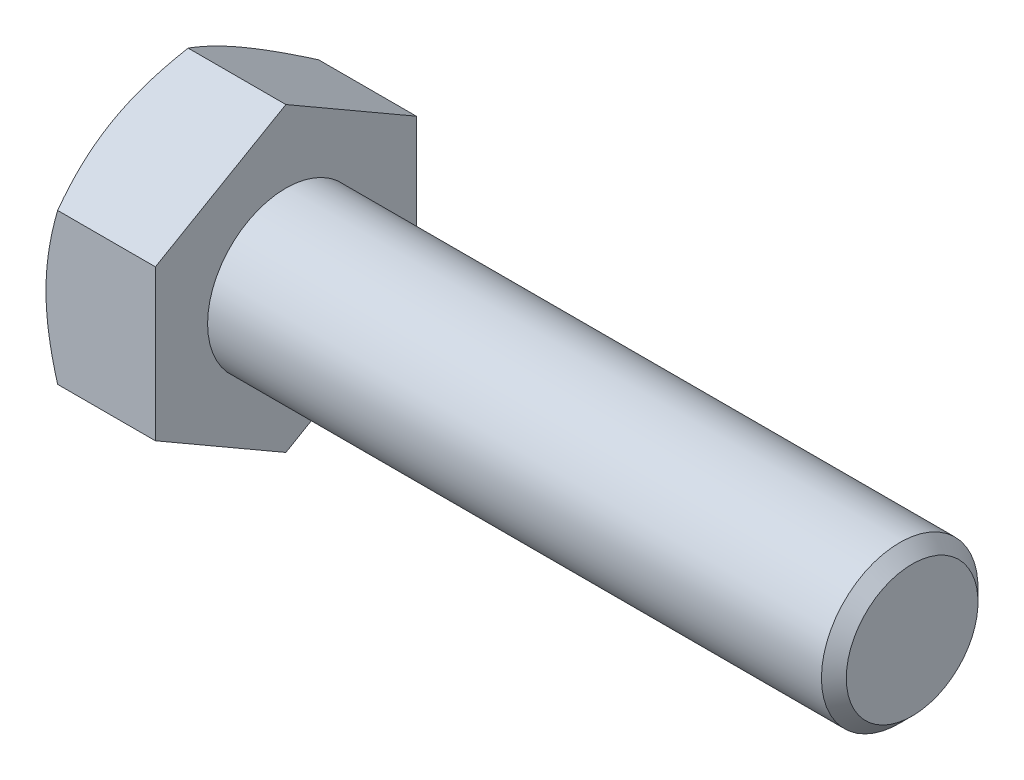
ISO-10303-21;
HEADER;
FILE_DESCRIPTION(('STEP AP214'),'2;1');
FILE_NAME('part.step','',(''),(''),'','','');
FILE_SCHEMA(('AUTOMOTIVE_DESIGN { 1 0 10303 214 1 1 1 1 }'));
ENDSEC;
DATA;
#1=APPLICATION_CONTEXT('core data for automotive mechanical design processes');
#2=APPLICATION_PROTOCOL_DEFINITION('international standard','automotive_design',2000,#1);
#3=PRODUCT_CONTEXT('',#1,'mechanical');
#4=PRODUCT('Part','Part','',(#3));
#5=PRODUCT_RELATED_PRODUCT_CATEGORY('part','',(#4));
#6=PRODUCT_DEFINITION_FORMATION('','',#4);
#7=PRODUCT_DEFINITION_CONTEXT('part definition',#1,'design');
#8=PRODUCT_DEFINITION('design','',#6,#7);
#9=PRODUCT_DEFINITION_SHAPE('','',#8);
#10=(LENGTH_UNIT() NAMED_UNIT(*) SI_UNIT(.MILLI.,.METRE.));
#11=(NAMED_UNIT(*) PLANE_ANGLE_UNIT() SI_UNIT($,.RADIAN.));
#12=(NAMED_UNIT(*) SI_UNIT($,.STERADIAN.) SOLID_ANGLE_UNIT());
#13=UNCERTAINTY_MEASURE_WITH_UNIT(LENGTH_MEASURE(1.E-05),#10,'distance_accuracy_value','');
#14=(GEOMETRIC_REPRESENTATION_CONTEXT(3) GLOBAL_UNCERTAINTY_ASSIGNED_CONTEXT((#13)) GLOBAL_UNIT_ASSIGNED_CONTEXT((#10,
#11,#12)) REPRESENTATION_CONTEXT('',''));
#15=CARTESIAN_POINT('',(0.,0.,0.));
#16=DIRECTION('',(0.,0.,1.));
#17=DIRECTION('',(1.,0.,0.));
#18=AXIS2_PLACEMENT_3D('',#15,#16,#17);
#19=CARTESIAN_POINT('',(13.3096,9.1654355233853,-15.875));
#20=DIRECTION('',(0.,-0.866025403784438,0.500000000000001));
#21=DIRECTION('',(0.,-0.500000000000001,-0.866025403784438));
#22=AXIS2_PLACEMENT_3D('',#19,#20,#21);
#23=PLANE('',#22);
#24=CARTESIAN_POINT('',(1.4179644772446,18.3309865168245,0.000200000000000058));
#25=CARTESIAN_POINT('',(1.30166349935356,18.1295339032351,-0.348726162054331));
#26=CARTESIAN_POINT('',(1.19064005208184,17.9272955162446,-0.699013323562702));
#27=CARTESIAN_POINT('',(0.980615189404248,17.5211970290311,-1.40239653629325));
#28=CARTESIAN_POINT('',(0.881617728014486,17.317336418786,-1.75549347089973));
#29=CARTESIAN_POINT('',(0.696975569734934,16.907599504169,-2.46517862475286));
#30=CARTESIAN_POINT('',(0.611362465613034,16.7017196143403,-2.8217730541929));
#31=CARTESIAN_POINT('',(0.45532738618748,16.2885292208317,-3.53743980894913));
#32=CARTESIAN_POINT('',(0.384904544248683,16.0812187994634,-3.89651199169763));
#33=CARTESIAN_POINT('',(0.262245312069867,15.6704794179803,-4.60793346909577));
#34=CARTESIAN_POINT('',(0.209602940833891,15.4670809513971,-4.96022994739949));
#35=CARTESIAN_POINT('',(0.121333390113917,15.0593520108342,-5.66643718817071));
#36=CARTESIAN_POINT('',(0.0857065381436126,14.8550215189913,-6.02034798157808));
#37=CARTESIAN_POINT('',(0.0323675832627824,14.4460172919899,-6.72876408325501));
#38=CARTESIAN_POINT('',(0.0146341921733754,14.2413442555777,-7.08326818126032));
#39=CARTESIAN_POINT('',(-0.00253647190704181,13.8318092543273,-7.79260361090378));
#40=CARTESIAN_POINT('',(-0.00197431023682724,13.6269472955224,-8.14743493209182));
#41=CARTESIAN_POINT('',(0.0161681092927598,13.2439598321846,-8.81078867725483));
#42=CARTESIAN_POINT('',(0.031535428502355,13.0658070333877,-9.11935837628174));
#43=CARTESIAN_POINT('',(0.0758164731953725,12.7099112295066,-9.73578799080438));
#44=CARTESIAN_POINT('',(0.104731156842696,12.5321682543017,-10.0436478545477));
#45=CARTESIAN_POINT('',(0.175602789161407,12.177188641073,-10.6584905803109));
#46=CARTESIAN_POINT('',(0.217570509466567,11.9999525436897,-10.9654725059141));
#47=CARTESIAN_POINT('',(0.313811907196353,11.6463112615745,-11.5779971741913));
#48=CARTESIAN_POINT('',(0.368086421198047,11.469906134162,-11.8835398175855));
#49=CARTESIAN_POINT('',(0.550742134607826,10.9344186122588,-12.811031412341));
#50=CARTESIAN_POINT('',(0.697335929410169,10.57688689335,-13.4302945148085));
#51=CARTESIAN_POINT('',(1.03004377733919,9.86715465547037,-14.6595868105855));
#52=CARTESIAN_POINT('',(1.21607969409906,9.51494504971995,-15.2696317426591));
#53=CARTESIAN_POINT('',(1.4179644772446,9.16532005333146,-15.8752));
#54=B_SPLINE_CURVE_WITH_KNOTS('',3,(#24,#25,#26,#27,#28,#29,#30,#31,#32,#33,#34,#35,#36,#37,#38,
#39,#40,#41,#42,#43,#44,#45,#46,#47,#48,#49,#50,#51,#52,#53),.UNSPECIFIED.,.F.,.F.,(4,2,2,2,2,2,
2,2,2,2,2,2,2,2,4),(0.,1.25809764419015,2.5166078242971,3.77804517463509,5.03941053837783,
6.26964248180284,7.49989810370428,8.72868833599616,9.95744059828984,11.0270932391011,
12.0968215446148,13.1674349646019,14.238121183346,16.4265775361706,18.6107383192463),.UNSPECIFIED.);
#55=CARTESIAN_POINT('',(1.41789780994802,18.3308710467706,0.));
#56=VERTEX_POINT('',#55);
#57=CARTESIAN_POINT('',(0.,13.748153285078,-7.93750000000001));
#58=VERTEX_POINT('',#57);
#59=EDGE_CURVE('E49',#56,#58,#54,.T.);
#60=ORIENTED_EDGE('',*,*,#59,.F.);
#61=DIRECTION('',(-1.,0.,0.));
#62=VECTOR('',#61,1.);
#63=CARTESIAN_POINT('',(13.3096,18.3308710467706,0.));
#64=LINE('',#63,#62);
#65=CARTESIAN_POINT('',(13.3096,18.3308710467706,0.));
#66=VERTEX_POINT('',#65);
#67=EDGE_CURVE('E145',#66,#56,#64,.T.);
#68=ORIENTED_EDGE('',*,*,#67,.F.);
#69=DIRECTION('',(0.,0.500000000000001,0.866025403784438));
#70=VECTOR('',#69,1.);
#71=CARTESIAN_POINT('',(13.3096,9.1654355233853,-15.875));
#72=LINE('',#71,#70);
#73=CARTESIAN_POINT('',(13.3096,9.1654355233853,-15.875));
#74=VERTEX_POINT('',#73);
#75=EDGE_CURVE('E236',#74,#66,#72,.T.);
#76=ORIENTED_EDGE('',*,*,#75,.F.);
#77=DIRECTION('',(-1.,0.,0.));
#78=VECTOR('',#77,1.);
#79=CARTESIAN_POINT('',(13.3096,9.1654355233853,-15.875));
#80=LINE('',#79,#78);
#81=CARTESIAN_POINT('',(1.41789780994801,9.1654355233853,-15.875));
#82=VERTEX_POINT('',#81);
#83=EDGE_CURVE('E133',#74,#82,#80,.T.);
#84=ORIENTED_EDGE('',*,*,#83,.T.);
#85=EDGE_CURVE('E127',#58,#82,#54,.T.);
#86=ORIENTED_EDGE('',*,*,#85,.F.);
#87=EDGE_LOOP('',(#60,#68,#76,#84,#86));
#88=FACE_BOUND('',#87,.T.);
#89=ADVANCED_FACE('F33',(#88),#23,.F.);
#90=CARTESIAN_POINT('',(13.3096,18.3308710467706,0.));
#91=DIRECTION('',(0.,-0.866025403784438,-0.500000000000001));
#92=DIRECTION('',(0.,0.500000000000001,-0.866025403784438));
#93=AXIS2_PLACEMENT_3D('',#90,#91,#92);
#94=PLANE('',#93);
#95=CARTESIAN_POINT('',(1.4179644772446,9.16532005333146,15.8752));
#96=CARTESIAN_POINT('',(1.30166349935355,9.36677266692083,15.5262738379457));
#97=CARTESIAN_POINT('',(1.19064005208183,9.56901105391136,15.1759866764373));
#98=CARTESIAN_POINT('',(0.98061518940424,9.97510954112481,14.4726034637067));
#99=CARTESIAN_POINT('',(0.881617728014476,10.1789701513699,14.1195065291003));
#100=CARTESIAN_POINT('',(0.696975569734926,10.5887070659869,13.4098213752471));
#101=CARTESIAN_POINT('',(0.611362465613028,10.7945869558156,13.0532269458071));
#102=CARTESIAN_POINT('',(0.455327386187475,11.2077773493242,12.3375601910509));
#103=CARTESIAN_POINT('',(0.384904544248679,11.4150877706925,11.9784880083024));
#104=CARTESIAN_POINT('',(0.262245312069862,11.8258271521756,11.2670665309042));
#105=CARTESIAN_POINT('',(0.209602940833887,12.0292256187588,10.9147700526005));
#106=CARTESIAN_POINT('',(0.121333390113914,12.4369545593218,10.2085628118293));
#107=CARTESIAN_POINT('',(0.0857065381436114,12.6412850511646,9.85465201842192));
#108=CARTESIAN_POINT('',(0.0323675832627816,13.0502892781661,9.14623591674499));
#109=CARTESIAN_POINT('',(0.0146341921733736,13.2549623145783,8.79173181873968));
#110=CARTESIAN_POINT('',(-0.00253647190704405,13.6644973158287,8.08239638909623));
#111=CARTESIAN_POINT('',(-0.00197431023682896,13.8693592746335,7.72756506790819));
#112=CARTESIAN_POINT('',(0.0161681092927607,14.2523467379713,7.06421132274518));
#113=CARTESIAN_POINT('',(0.0315354285023579,14.4304995367682,6.75564162371827));
#114=CARTESIAN_POINT('',(0.0758164731953773,14.7863953406493,6.13921200919563));
#115=CARTESIAN_POINT('',(0.104731156842701,14.9641383158542,5.83135214545234));
#116=CARTESIAN_POINT('',(0.175602789161412,15.3191179290829,5.21650941968907));
#117=CARTESIAN_POINT('',(0.217570509466573,15.4963540264663,4.90952749408591));
#118=CARTESIAN_POINT('',(0.313811907196359,15.8499953085814,4.29700282580869));
#119=CARTESIAN_POINT('',(0.368086421198053,16.026400435994,3.99146018241446));
#120=CARTESIAN_POINT('',(0.550742134607834,16.5618879578971,3.06396858765902));
#121=CARTESIAN_POINT('',(0.697335929410176,16.919419676806,2.44470548519147));
#122=CARTESIAN_POINT('',(1.0300437773392,17.6291519146856,1.21541318941447));
#123=CARTESIAN_POINT('',(1.21607969409907,17.981361520436,0.605368257340947));
#124=CARTESIAN_POINT('',(1.41796447724461,18.3309865168245,-0.000200000000000437));
#125=B_SPLINE_CURVE_WITH_KNOTS('',3,(#95,#96,#97,#98,#99,#100,#101,#102,#103,#104,#105,#106,
#107,#108,#109,#110,#111,#112,#113,#114,#115,#116,#117,#118,#119,#120,#121,#122,#123,#124),
.UNSPECIFIED.,.F.,.F.,(4,2,2,2,2,2,2,2,2,2,2,2,2,2,4),(0.,1.25809764419015,2.5166078242971,
3.77804517463509,5.03941053837783,6.26964248180283,7.49989810370428,8.72868833599616,
9.95744059828984,11.0270932391011,12.0968215446148,13.1674349646019,14.238121183346,
16.4265775361706,18.6107383192463),.UNSPECIFIED.);
#126=CARTESIAN_POINT('',(1.41789780994801,9.1654355233853,15.875));
#127=VERTEX_POINT('',#126);
#128=CARTESIAN_POINT('',(0.,13.748153285078,7.93750000000002));
#129=VERTEX_POINT('',#128);
#130=EDGE_CURVE('E56',#127,#129,#125,.T.);
#131=ORIENTED_EDGE('',*,*,#130,.F.);
#132=DIRECTION('',(-1.,0.,0.));
#133=VECTOR('',#132,1.);
#134=CARTESIAN_POINT('',(13.3096,9.1654355233853,15.875));
#135=LINE('',#134,#133);
#136=CARTESIAN_POINT('',(13.3096,9.1654355233853,15.875));
#137=VERTEX_POINT('',#136);
#138=EDGE_CURVE('E143',#137,#127,#135,.T.);
#139=ORIENTED_EDGE('',*,*,#138,.F.);
#140=DIRECTION('',(0.,-0.500000000000001,0.866025403784438));
#141=VECTOR('',#140,1.);
#142=CARTESIAN_POINT('',(13.3096,18.3308710467706,0.));
#143=LINE('',#142,#141);
#144=EDGE_CURVE('E234',#66,#137,#143,.T.);
#145=ORIENTED_EDGE('',*,*,#144,.F.);
#146=ORIENTED_EDGE('',*,*,#67,.T.);
#147=EDGE_CURVE('E160',#129,#56,#125,.T.);
#148=ORIENTED_EDGE('',*,*,#147,.F.);
#149=EDGE_LOOP('',(#131,#139,#145,#146,#148));
#150=FACE_BOUND('',#149,.T.);
#151=ADVANCED_FACE('F166',(#150),#94,.F.);
#152=CARTESIAN_POINT('',(13.3096,9.1654355233853,15.875));
#153=DIRECTION('',(0.,0.,-1.));
#154=DIRECTION('',(-1.,0.,0.));
#155=AXIS2_PLACEMENT_3D('',#152,#153,#154);
#156=PLANE('',#155);
#157=CARTESIAN_POINT('',(7.8449738665648,-24.8202831942167,15.875));
#158=CARTESIAN_POINT('',(7.67595391610504,-24.4727664687582,15.875));
#159=CARTESIAN_POINT('',(7.50776171164911,-24.1248473453157,15.875));
#160=CARTESIAN_POINT('',(7.17321986885552,-23.4281204028295,15.875));
#161=CARTESIAN_POINT('',(7.00687024843962,-23.0793125751824,15.875));
#162=CARTESIAN_POINT('',(6.51082331866861,-22.031340044132,15.875));
#163=CARTESIAN_POINT('',(6.18417657561707,-21.3307260199499,15.875));
#164=CARTESIAN_POINT('',(5.53923926992154,-19.9211586358427,15.875));
#165=CARTESIAN_POINT('',(5.22100216769578,-19.2121807579059,15.875));
#166=CARTESIAN_POINT('',(4.59728002286789,-17.7886568536021,15.875));
#167=CARTESIAN_POINT('',(4.29179439112062,-17.0741110862975,15.875));
#168=CARTESIAN_POINT('',(3.68705721665467,-15.6144543218925,15.875));
#169=CARTESIAN_POINT('',(3.38835008065788,-14.869116616556,15.875));
#170=CARTESIAN_POINT('',(2.81305944514715,-13.3697904144502,15.875));
#171=CARTESIAN_POINT('',(2.53647840049528,-12.6158009683632,15.875));
#172=CARTESIAN_POINT('',(2.01255860722672,-11.0993435359999,15.875));
#173=CARTESIAN_POINT('',(1.76516234753209,-10.3368955770385,15.875));
#174=CARTESIAN_POINT('',(1.30740290737887,-8.80099241673028,15.875));
#175=CARTESIAN_POINT('',(1.09702827238097,-8.02754070029573,15.875));
#176=CARTESIAN_POINT('',(0.817325617572153,-6.86111841594317,15.875));
#177=CARTESIAN_POINT('',(0.73026359893264,-6.47237592065168,15.875));
#178=CARTESIAN_POINT('',(0.56910867905308,-5.69219801218947,15.875));
#179=CARTESIAN_POINT('',(0.49501552140516,-5.30076265241853,15.875));
#180=CARTESIAN_POINT('',(0.361093380789722,-4.5154534684337,15.875));
#181=CARTESIAN_POINT('',(0.301264170074855,-4.1215796832563,15.875));
#182=CARTESIAN_POINT('',(0.197055971874635,-3.33179689837237,15.875));
#183=CARTESIAN_POINT('',(0.152676301807647,-2.93588798936482,15.875));
#184=CARTESIAN_POINT('',(0.0808161975917861,-2.14784188257325,15.875));
#185=CARTESIAN_POINT('',(0.0531187557699647,-1.75572459558229,15.875));
#186=CARTESIAN_POINT('',(0.0143409935999058,-0.970670139802986,15.875));
#187=CARTESIAN_POINT('',(0.00326039188680345,-0.577732985009881,15.875));
#188=CARTESIAN_POINT('',(-0.00201925130471729,0.208258020823028,15.875));
#189=CARTESIAN_POINT('',(0.00378172153558958,0.601311871961529,15.875));
#190=CARTESIAN_POINT('',(0.0321213076171285,1.38682038609096,15.875));
#191=CARTESIAN_POINT('',(0.0546606673300768,1.77927502157685,15.875));
#192=CARTESIAN_POINT('',(0.127986774695392,2.71645285640235,15.875));
#193=CARTESIAN_POINT('',(0.186380792561224,3.26059173949289,15.875));
#194=CARTESIAN_POINT('',(0.33221325139397,4.34496561712487,15.875));
#195=CARTESIAN_POINT('',(0.419655475266207,4.88520009383364,15.875));
#196=CARTESIAN_POINT('',(0.620474052556269,5.9612043869461,15.875));
#197=CARTESIAN_POINT('',(0.733870017611176,6.49697050795818,15.875));
#198=CARTESIAN_POINT('',(0.983124574893512,7.56319485623629,15.875));
#199=CARTESIAN_POINT('',(1.11898287475857,8.09365315249193,15.875));
#200=CARTESIAN_POINT('',(1.41309058085111,9.16105549068253,15.875));
#201=CARTESIAN_POINT('',(1.57177257001988,9.69787950685414,15.875));
#202=CARTESIAN_POINT('',(1.90593867975274,10.7662423985403,15.875));
#203=CARTESIAN_POINT('',(2.08142291423849,11.2977812381935,15.875));
#204=CARTESIAN_POINT('',(2.44637177911001,12.3558294430634,15.875));
#205=CARTESIAN_POINT('',(2.6358320415017,12.8823403220753,15.875));
#206=CARTESIAN_POINT('',(3.0264642312182,13.9309723057094,15.875));
#207=CARTESIAN_POINT('',(3.22763600157381,14.4530934690596,15.875));
#208=CARTESIAN_POINT('',(3.72655173579078,15.7125455250726,15.875));
#209=CARTESIAN_POINT('',(4.02928354883834,16.44789788487,15.875));
#210=CARTESIAN_POINT('',(4.65015898963173,17.9120878527412,15.875));
#211=CARTESIAN_POINT('',(4.96830369817316,18.6409249996929,15.875));
#212=CARTESIAN_POINT('',(5.61682913078198,20.0933407142771,15.875));
#213=CARTESIAN_POINT('',(5.94721292884127,20.8169179054689,15.875));
#214=CARTESIAN_POINT('',(6.617672219521,22.2595345089717,15.875));
#215=CARTESIAN_POINT('',(6.95774747453029,22.9785740320082,15.875));
#216=CARTESIAN_POINT('',(7.64613929747713,24.4137493738295,15.875));
#217=CARTESIAN_POINT('',(7.9944652449015,25.1298806854519,15.875));
#218=CARTESIAN_POINT('',(8.69752300673555,26.5589916209534,15.875));
#219=CARTESIAN_POINT('',(9.05225485281008,27.2719712292318,15.875));
#220=CARTESIAN_POINT('',(9.76694765394667,28.6951744466399,15.875));
#221=CARTESIAN_POINT('',(10.126907855315,29.4053984346646,15.875));
#222=CARTESIAN_POINT('',(10.8512282962132,30.82359492193,15.875));
#223=CARTESIAN_POINT('',(11.2155885265026,31.5315674258951,15.875));
#224=CARTESIAN_POINT('',(12.2500056643277,33.5287000442288,15.875));
#225=CARTESIAN_POINT('',(12.9243514359269,34.815638612065,15.875));
#226=CARTESIAN_POINT('',(14.2821577230813,37.384752577811,15.875));
#227=CARTESIAN_POINT('',(14.96561860221,38.6669277831013,15.875));
#228=CARTESIAN_POINT('',(16.3376382492631,41.224107123951,15.875));
#229=CARTESIAN_POINT('',(17.0261783698581,42.4991212713774,15.875));
#230=CARTESIAN_POINT('',(18.0630078608122,44.4094093383701,15.875));
#231=CARTESIAN_POINT('',(18.4092773558344,45.0457811933279,15.875));
#232=CARTESIAN_POINT('',(19.1030208958834,46.3178667849535,15.875));
#233=CARTESIAN_POINT('',(19.4504949390654,46.9535805226274,15.875));
#234=CARTESIAN_POINT('',(19.7985008753637,47.5890030378064,15.875));
#235=B_SPLINE_CURVE_WITH_KNOTS('',3,(#157,#158,#159,#160,#161,#162,#163,#164,#165,#166,#167,
#168,#169,#170,#171,#172,#173,#174,#175,#176,#177,#178,#179,#180,#181,#182,#183,#184,#185,#186,
#187,#188,#189,#190,#191,#192,#193,#194,#195,#196,#197,#198,#199,#200,#201,#202,#203,#204,#205,
#206,#207,#208,#209,#210,#211,#212,#213,#214,#215,#216,#217,#218,#219,#220,#221,#222,#223,#224,
#225,#226,#227,#228,#229,#230,#231,#232,#233,#234),.UNSPECIFIED.,.F.,.F.,(4,2,2,2,2,2,2,2,2,2,2,
2,2,2,2,2,2,2,2,2,2,2,2,2,2,2,2,2,2,2,2,2,2,2,2,2,2,2,4),(0.,1.15931697190947,2.31864520994502,
4.63763453110136,6.96891393744049,9.30008551420875,11.7087149522965,14.1176112552388,
16.5216783943489,18.9250003991386,20.1199361145776,21.3148482022251,22.5097412098598,
23.7045814188007,24.8835227916953,26.0624442019241,27.2413666120986,28.4203416011202,
30.061227688609,31.7023275501152,33.3446716075257,34.9869942904079,36.666023488277,
38.3450640710135,40.0235821005669,41.7020776381421,44.0875229720481,46.4731358228963,
48.859351965917,51.2455096549223,53.6345241845044,56.0235505264023,58.4122358303755,
60.8009161187089,65.1595962864933,69.5184508315968,73.8655858120792,76.0390257461071,
78.2124623526533),.UNSPECIFIED.);
#236=CARTESIAN_POINT('',(1.41789780994802,-9.16543552338532,15.875));
#237=VERTEX_POINT('',#236);
#238=CARTESIAN_POINT('',(0.,0.,15.875));
#239=VERTEX_POINT('',#238);
#240=EDGE_CURVE('E246',#237,#239,#235,.T.);
#241=ORIENTED_EDGE('',*,*,#240,.F.);
#242=DIRECTION('',(-1.,0.,0.));
#243=VECTOR('',#242,1.);
#244=CARTESIAN_POINT('',(13.3096,-9.16543552338532,15.875));
#245=LINE('',#244,#243);
#246=CARTESIAN_POINT('',(13.3096,-9.16543552338532,15.875));
#247=VERTEX_POINT('',#246);
#248=EDGE_CURVE('E135',#247,#237,#245,.T.);
#249=ORIENTED_EDGE('',*,*,#248,.F.);
#250=DIRECTION('',(0.,-1.,0.));
#251=VECTOR('',#250,1.);
#252=CARTESIAN_POINT('',(13.3096,9.1654355233853,15.875));
#253=LINE('',#252,#251);
#254=EDGE_CURVE('E230',#137,#247,#253,.T.);
#255=ORIENTED_EDGE('',*,*,#254,.F.);
#256=ORIENTED_EDGE('',*,*,#138,.T.);
#257=EDGE_CURVE('E184',#239,#127,#235,.T.);
#258=ORIENTED_EDGE('',*,*,#257,.F.);
#259=EDGE_LOOP('',(#241,#249,#255,#256,#258));
#260=FACE_BOUND('',#259,.T.);
#261=ADVANCED_FACE('F252',(#260),#156,.F.);
#262=CARTESIAN_POINT('',(13.3096,-18.3308710467707,0.));
#263=DIRECTION('',(0.,0.866025403784438,-0.500000000000001));
#264=DIRECTION('',(0.,0.500000000000001,0.866025403784438));
#265=AXIS2_PLACEMENT_3D('',#262,#263,#264);
#266=PLANE('',#265);
#267=CARTESIAN_POINT('',(1.41796447724462,-18.3309865168245,-0.00019999999999989));
#268=CARTESIAN_POINT('',(1.30166349935358,-18.1295339032351,0.34872616205433));
#269=CARTESIAN_POINT('',(1.19064005208185,-17.9272955162446,0.699013323562702));
#270=CARTESIAN_POINT('',(0.980615189404262,-17.5211970290311,1.40239653629326));
#271=CARTESIAN_POINT('',(0.881617728014498,-17.3173364187861,1.75549347089974));
#272=CARTESIAN_POINT('',(0.696975569734946,-16.9075995041691,2.46517862475287));
#273=CARTESIAN_POINT('',(0.611362465613047,-16.7017196143403,2.82177305419291));
#274=CARTESIAN_POINT('',(0.455327386187493,-16.2885292208318,3.53743980894913));
#275=CARTESIAN_POINT('',(0.384904544248696,-16.0812187994634,3.89651199169764));
#276=CARTESIAN_POINT('',(0.262245312069879,-15.6704794179803,4.60793346909578));
#277=CARTESIAN_POINT('',(0.209602940833904,-15.4670809513971,4.9602299473995));
#278=CARTESIAN_POINT('',(0.121333390113932,-15.0593520108342,5.66643718817071));
#279=CARTESIAN_POINT('',(0.0857065381436275,-14.8550215189913,6.02034798157809));
#280=CARTESIAN_POINT('',(0.0323675832627955,-14.4460172919899,6.72876408325502));
#281=CARTESIAN_POINT('',(0.0146341921733866,-14.2413442555777,7.08326818126033));
#282=CARTESIAN_POINT('',(-0.0025364719070315,-13.8318092543273,7.79260361090379));
#283=CARTESIAN_POINT('',(-0.00197431023681589,-13.6269472955225,8.14743493209183));
#284=CARTESIAN_POINT('',(0.0161681092927723,-13.2439598321847,8.81078867725484));
#285=CARTESIAN_POINT('',(0.0315354285023677,-13.0658070333877,9.11935837628175));
#286=CARTESIAN_POINT('',(0.075816473195385,-12.7099112295066,9.73578799080438));
#287=CARTESIAN_POINT('',(0.104731156842708,-12.5321682543017,10.0436478545477));
#288=CARTESIAN_POINT('',(0.175602789161419,-12.177188641073,10.6584905803109));
#289=CARTESIAN_POINT('',(0.217570509466579,-11.9999525436897,10.9654725059141));
#290=CARTESIAN_POINT('',(0.313811907196365,-11.6463112615746,11.5779971741913));
#291=CARTESIAN_POINT('',(0.368086421198059,-11.469906134162,11.8835398175855));
#292=CARTESIAN_POINT('',(0.550742134607837,-10.9344186122588,12.811031412341));
#293=CARTESIAN_POINT('',(0.697335929410179,-10.57688689335,13.4302945148085));
#294=CARTESIAN_POINT('',(1.0300437773392,-9.86715465547039,14.6595868105855));
#295=CARTESIAN_POINT('',(1.21607969409907,-9.51494504971997,15.2696317426591));
#296=CARTESIAN_POINT('',(1.4179644772446,-9.16532005333149,15.8752));
#297=B_SPLINE_CURVE_WITH_KNOTS('',3,(#267,#268,#269,#270,#271,#272,#273,#274,#275,#276,#277,
#278,#279,#280,#281,#282,#283,#284,#285,#286,#287,#288,#289,#290,#291,#292,#293,#294,#295,#296),
.UNSPECIFIED.,.F.,.F.,(4,2,2,2,2,2,2,2,2,2,2,2,2,2,4),(0.,1.25809764419015,2.5166078242971,
3.7780451746351,5.03941053837785,6.26964248180284,7.49989810370429,8.72868833599617,
9.95744059828986,11.0270932391011,12.0968215446148,13.1674349646019,14.238121183346,
16.4265775361706,18.6107383192463),.UNSPECIFIED.);
#298=CARTESIAN_POINT('',(1.41789780994804,-18.3308710467707,0.));
#299=VERTEX_POINT('',#298);
#300=CARTESIAN_POINT('',(0.,-13.748153285078,7.93750000000002));
#301=VERTEX_POINT('',#300);
#302=EDGE_CURVE('E168',#299,#301,#297,.T.);
#303=ORIENTED_EDGE('',*,*,#302,.F.);
#304=DIRECTION('',(-1.,0.,0.));
#305=VECTOR('',#304,1.);
#306=CARTESIAN_POINT('',(13.3096,-18.3308710467707,0.));
#307=LINE('',#306,#305);
#308=CARTESIAN_POINT('',(13.3096,-18.3308710467707,0.));
#309=VERTEX_POINT('',#308);
#310=EDGE_CURVE('E132',#309,#299,#307,.T.);
#311=ORIENTED_EDGE('',*,*,#310,.F.);
#312=DIRECTION('',(0.,-0.500000000000001,-0.866025403784438));
#313=VECTOR('',#312,1.);
#314=CARTESIAN_POINT('',(13.3096,-18.3308710467707,0.));
#315=LINE('',#314,#313);
#316=EDGE_CURVE('E228',#247,#309,#315,.T.);
#317=ORIENTED_EDGE('',*,*,#316,.F.);
#318=ORIENTED_EDGE('',*,*,#248,.T.);
#319=EDGE_CURVE('E170',#301,#237,#297,.T.);
#320=ORIENTED_EDGE('',*,*,#319,.F.);
#321=EDGE_LOOP('',(#303,#311,#317,#318,#320));
#322=FACE_BOUND('',#321,.T.);
#323=ADVANCED_FACE('F224',(#322),#266,.F.);
#324=CARTESIAN_POINT('',(13.3096,-9.16543552338533,-15.875));
#325=DIRECTION('',(0.,0.866025403784438,0.5));
#326=DIRECTION('',(0.,-0.5,0.866025403784439));
#327=AXIS2_PLACEMENT_3D('',#324,#325,#326);
#328=PLANE('',#327);
#329=CARTESIAN_POINT('',(1.41796447724461,-9.1653200533315,-15.8752));
#330=CARTESIAN_POINT('',(1.30166349935356,-9.36677266692087,-15.5262738379457));
#331=CARTESIAN_POINT('',(1.19064005208184,-9.56901105391139,-15.1759866764373));
#332=CARTESIAN_POINT('',(0.980615189404254,-9.97510954112484,-14.4726034637068));
#333=CARTESIAN_POINT('',(0.881617728014492,-10.1789701513699,-14.1195065291003));
#334=CARTESIAN_POINT('',(0.696975569734942,-10.5887070659869,-13.4098213752471));
#335=CARTESIAN_POINT('',(0.611362465613043,-10.7945869558156,-13.0532269458071));
#336=CARTESIAN_POINT('',(0.455327386187489,-11.2077773493242,-12.3375601910509));
#337=CARTESIAN_POINT('',(0.384904544248692,-11.4150877706926,-11.9784880083024));
#338=CARTESIAN_POINT('',(0.262245312069876,-11.8258271521757,-11.2670665309042));
#339=CARTESIAN_POINT('',(0.209602940833902,-12.0292256187589,-10.9147700526005));
#340=CARTESIAN_POINT('',(0.12133339011393,-12.4369545593218,-10.2085628118293));
#341=CARTESIAN_POINT('',(0.0857065381436266,-12.6412850511647,-9.85465201842192));
#342=CARTESIAN_POINT('',(0.0323675832627964,-13.0502892781661,-9.14623591674499));
#343=CARTESIAN_POINT('',(0.014634192173389,-13.2549623145783,-8.79173181873968));
#344=CARTESIAN_POINT('',(-0.00253647190702835,-13.6644973158287,-8.08239638909622));
#345=CARTESIAN_POINT('',(-0.00197431023681342,-13.8693592746335,-7.72756506790818));
#346=CARTESIAN_POINT('',(0.0161681092927767,-14.2523467379713,-7.06421132274517));
#347=CARTESIAN_POINT('',(0.0315354285023744,-14.4304995367683,-6.75564162371826));
#348=CARTESIAN_POINT('',(0.0758164731953943,-14.7863953406494,-6.13921200919562));
#349=CARTESIAN_POINT('',(0.104731156842718,-14.9641383158542,-5.83135214545233));
#350=CARTESIAN_POINT('',(0.175602789161428,-15.319117929083,-5.21650941968907));
#351=CARTESIAN_POINT('',(0.217570509466588,-15.4963540264663,-4.90952749408591));
#352=CARTESIAN_POINT('',(0.313811907196374,-15.8499953085814,-4.29700282580869));
#353=CARTESIAN_POINT('',(0.36808642119807,-16.026400435994,-3.99146018241446));
#354=CARTESIAN_POINT('',(0.55074213460785,-16.5618879578972,-3.06396858765902));
#355=CARTESIAN_POINT('',(0.697335929410193,-16.919419676806,-2.44470548519147));
#356=CARTESIAN_POINT('',(1.03004377733922,-17.6291519146856,-1.21541318941447));
#357=CARTESIAN_POINT('',(1.21607969409908,-17.981361520436,-0.605368257340946));
#358=CARTESIAN_POINT('',(1.41796447724462,-18.3309865168245,0.000200000000001088));
#359=B_SPLINE_CURVE_WITH_KNOTS('',3,(#329,#330,#331,#332,#333,#334,#335,#336,#337,#338,#339,
#340,#341,#342,#343,#344,#345,#346,#347,#348,#349,#350,#351,#352,#353,#354,#355,#356,#357,#358),
.UNSPECIFIED.,.F.,.F.,(4,2,2,2,2,2,2,2,2,2,2,2,2,2,4),(0.,1.25809764419015,2.5166078242971,
3.77804517463509,5.03941053837784,6.26964248180284,7.49989810370429,8.72868833599616,
9.95744059828985,11.0270932391011,12.0968215446148,13.1674349646019,14.238121183346,
16.4265775361706,18.6107383192463),.UNSPECIFIED.);
#360=CARTESIAN_POINT('',(1.41789780994803,-9.16543552338533,-15.875));
#361=VERTEX_POINT('',#360);
#362=CARTESIAN_POINT('',(0.,-13.748153285078,-7.93750000000001));
#363=VERTEX_POINT('',#362);
#364=EDGE_CURVE('E109',#361,#363,#359,.T.);
#365=ORIENTED_EDGE('',*,*,#364,.F.);
#366=DIRECTION('',(-1.,0.,0.));
#367=VECTOR('',#366,1.);
#368=CARTESIAN_POINT('',(13.3096,-9.16543552338533,-15.875));
#369=LINE('',#368,#367);
#370=CARTESIAN_POINT('',(13.3096,-9.16543552338533,-15.875));
#371=VERTEX_POINT('',#370);
#372=EDGE_CURVE('E123',#371,#361,#369,.T.);
#373=ORIENTED_EDGE('',*,*,#372,.F.);
#374=DIRECTION('',(0.,0.5,-0.866025403784438));
#375=VECTOR('',#374,1.);
#376=CARTESIAN_POINT('',(13.3096,-9.16543552338533,-15.875));
#377=LINE('',#376,#375);
#378=EDGE_CURVE('E226',#309,#371,#377,.T.);
#379=ORIENTED_EDGE('',*,*,#378,.F.);
#380=ORIENTED_EDGE('',*,*,#310,.T.);
#381=EDGE_CURVE('E126',#363,#299,#359,.T.);
#382=ORIENTED_EDGE('',*,*,#381,.F.);
#383=EDGE_LOOP('',(#365,#373,#379,#380,#382));
#384=FACE_BOUND('',#383,.T.);
#385=ADVANCED_FACE('F121',(#384),#328,.F.);
#386=CARTESIAN_POINT('',(13.3096,9.1654355233853,-15.875));
#387=DIRECTION('',(0.,0.,1.));
#388=DIRECTION('',(0.,-1.,0.));
#389=AXIS2_PLACEMENT_3D('',#386,#387,#388);
#390=PLANE('',#389);
#391=CARTESIAN_POINT('',(7.84497386865805,-24.8202831985204,-15.875));
#392=CARTESIAN_POINT('',(7.6759539181546,-24.4727664729897,-15.875));
#393=CARTESIAN_POINT('',(7.507761713655,-24.1248473494748,-15.875));
#394=CARTESIAN_POINT('',(7.17321987077414,-23.4281204068438,-15.875));
#395=CARTESIAN_POINT('',(7.00687025031465,-23.0793125791242,-15.875));
#396=CARTESIAN_POINT('',(6.51082332041299,-22.0313400478563,-15.875));
#397=CARTESIAN_POINT('',(6.18417657727456,-21.3307260235289,-15.875));
#398=CARTESIAN_POINT('',(5.53923927140517,-19.9211586391291,-15.875));
#399=CARTESIAN_POINT('',(5.22100216909248,-19.2121807610448,-15.875));
#400=CARTESIAN_POINT('',(4.59728002409216,-17.788656856445,-15.875));
#401=CARTESIAN_POINT('',(4.29179439225939,-17.074111088992,-15.875));
#402=CARTESIAN_POINT('',(3.68705721761998,-15.6144543242784,-15.875));
#403=CARTESIAN_POINT('',(3.38835008153541,-14.8691166187819,-15.875));
#404=CARTESIAN_POINT('',(2.81305944585384,-13.3697904163532,-15.875));
#405=CARTESIAN_POINT('',(2.53647840111889,-12.6158009701034,-15.875));
#406=CARTESIAN_POINT('',(2.01255860769216,-11.0993435374117,-15.875));
#407=CARTESIAN_POINT('',(1.76516234792241,-10.3368955782846,-15.875));
#408=CARTESIAN_POINT('',(1.30740290763122,-8.80099241764038,-15.875));
#409=CARTESIAN_POINT('',(1.09702827257047,-8.02754070103554,-15.875));
#410=CARTESIAN_POINT('',(0.817325617671514,-6.86111841638255,-15.875));
#411=CARTESIAN_POINT('',(0.730263598998961,-6.47237592096259,-15.875));
#412=CARTESIAN_POINT('',(0.569108679061753,-5.69219801224159,-15.875));
#413=CARTESIAN_POINT('',(0.495015521389224,-5.30076265234035,-15.875));
#414=CARTESIAN_POINT('',(0.361093380734312,-4.51545346809347,-15.875));
#415=CARTESIAN_POINT('',(0.301264170004575,-4.12157968278434,-15.875));
#416=CARTESIAN_POINT('',(0.19705597178546,-3.33179689763583,-15.875));
#417=CARTESIAN_POINT('',(0.152676301714447,-2.93588798849543,-15.875));
#418=CARTESIAN_POINT('',(0.0808161975022752,-2.14784188144095,-15.875));
#419=CARTESIAN_POINT('',(0.0531187556879546,-1.75572459431993,-15.875));
#420=CARTESIAN_POINT('',(0.0143409935443761,-0.970670138280769,-15.875));
#421=CARTESIAN_POINT('',(0.00326039185025307,-0.577732983357869,-15.875));
#422=CARTESIAN_POINT('',(-0.00201925129209742,0.208258022733666,-15.875));
#423=CARTESIAN_POINT('',(0.00378172157840293,0.601311874000999,-15.875));
#424=CARTESIAN_POINT('',(0.0321213077307335,1.38682038838639,-15.875));
#425=CARTESIAN_POINT('',(0.0546606674842801,1.7792750239994,-15.875));
#426=CARTESIAN_POINT('',(0.127986774949465,2.71645285902166,-15.875));
#427=CARTESIAN_POINT('',(0.186380792872826,3.26059174218126,-15.875));
#428=CARTESIAN_POINT('',(0.332213251823682,4.34496561994825,-15.875));
#429=CARTESIAN_POINT('',(0.419655475756502,4.88520009672297,-15.875));
#430=CARTESIAN_POINT('',(0.620474053168688,5.96120438996491,-15.875));
#431=CARTESIAN_POINT('',(0.733870018285141,6.49697051104051,-15.875));
#432=CARTESIAN_POINT('',(0.98312457568997,7.56319485944381,-15.875));
#433=CARTESIAN_POINT('',(1.11898287561598,8.09365315576113,-15.875));
#434=CARTESIAN_POINT('',(1.4130905818307,9.16105549407674,-15.875));
#435=CARTESIAN_POINT('',(1.57177257106072,9.69787951031165,-15.875));
#436=CARTESIAN_POINT('',(1.90593868091419,10.7662424021237,-15.875));
#437=CARTESIAN_POINT('',(2.0814229154593,11.2977812418396,-15.875));
#438=CARTESIAN_POINT('',(2.44637178044745,12.3558294468342,-15.875));
#439=CARTESIAN_POINT('',(2.63583204289641,12.8823403259082,-15.875));
#440=CARTESIAN_POINT('',(3.02646423272546,13.9309723096667,-15.875));
#441=CARTESIAN_POINT('',(3.22763600313636,14.453093473079,-15.875));
#442=CARTESIAN_POINT('',(3.72655173744173,15.7125455291335,-15.875));
#443=CARTESIAN_POINT('',(4.02928355051855,16.4478978889114,-15.875));
#444=CARTESIAN_POINT('',(4.65015899136337,17.912087856746,-15.875));
#445=CARTESIAN_POINT('',(4.96830369992694,18.6409250036804,-15.875));
#446=CARTESIAN_POINT('',(5.61682913257465,20.0933407182321,-15.875));
#447=CARTESIAN_POINT('',(5.94721293065068,20.8169179094085,-15.875));
#448=CARTESIAN_POINT('',(6.61767222135984,22.259534512882,-15.875));
#449=CARTESIAN_POINT('',(6.95774747638183,22.9785740359048,-15.875));
#450=CARTESIAN_POINT('',(7.64613929935069,24.4137493776991,-15.875));
#451=CARTESIAN_POINT('',(7.99446524678435,25.1298806893083,-15.875));
#452=CARTESIAN_POINT('',(8.69752300863461,26.5589916247846,-15.875));
#453=CARTESIAN_POINT('',(9.05225485471604,27.2719712330508,-15.875));
#454=CARTESIAN_POINT('',(9.76694765586461,28.6951744504356,-15.875));
#455=CARTESIAN_POINT('',(10.126907857238,29.4053984384491,-15.875));
#456=CARTESIAN_POINT('',(10.851228298145,30.8235949256929,-15.875));
#457=CARTESIAN_POINT('',(11.2155885284379,31.5315674296476,-15.875));
#458=CARTESIAN_POINT('',(12.2500056662792,33.5287000479673,-15.875));
#459=CARTESIAN_POINT('',(12.9243514378898,34.8156386158005,-15.875));
#460=CARTESIAN_POINT('',(14.2821577250645,37.3847525815418,-15.875));
#461=CARTESIAN_POINT('',(14.965618604202,38.6669277868303,-15.875));
#462=CARTESIAN_POINT('',(16.3376382512727,41.2241071276801,-15.875));
#463=CARTESIAN_POINT('',(17.0261783718762,42.4991212751084,-15.875));
#464=CARTESIAN_POINT('',(18.0630078628424,44.4094093421043,-15.875));
#465=CARTESIAN_POINT('',(18.4092773578684,45.0457811970633,-15.875));
#466=CARTESIAN_POINT('',(19.103020897925,46.3178667886914,-15.875));
#467=CARTESIAN_POINT('',(19.4504949411105,46.9535805263666,-15.875));
#468=CARTESIAN_POINT('',(19.7985008774123,47.5890030415469,-15.875));
#469=B_SPLINE_CURVE_WITH_KNOTS('',3,(#391,#392,#393,#394,#395,#396,#397,#398,#399,#400,#401,
#402,#403,#404,#405,#406,#407,#408,#409,#410,#411,#412,#413,#414,#415,#416,#417,#418,#419,#420,
#421,#422,#423,#424,#425,#426,#427,#428,#429,#430,#431,#432,#433,#434,#435,#436,#437,#438,#439,
#440,#441,#442,#443,#444,#445,#446,#447,#448,#449,#450,#451,#452,#453,#454,#455,#456,#457,#458,
#459,#460,#461,#462,#463,#464,#465,#466,#467,#468),.UNSPECIFIED.,.F.,.F.,(4,2,2,2,2,2,2,2,2,2,2,
2,2,2,2,2,2,2,2,2,2,2,2,2,2,2,2,2,2,2,2,2,2,2,2,2,2,2,4),(0.,1.15931697216195,2.31864521044998,
4.63763453211135,6.96891393896091,9.30008551623956,11.7087149548712,14.1176112583574,
16.5216783980097,18.9250004033412,20.1199361191777,21.3148482072228,22.5097412152547,
23.7045814245927,24.8835227978745,26.0624442084906,27.2413666190524,28.4203416084616,
30.0612276961746,31.7023275579052,33.3446716155403,34.9869942986472,36.6660234967506,
38.3450640797214,40.0235821095084,41.7020776473174,44.087522981203,46.4731358320306,
48.8593519750303,51.2455096640144,53.6345241935733,56.0235505354478,58.4122358393981,
60.8009161277085,65.159596295501,69.5184508406123,73.8655858211119,76.0390257551484,
78.2124623617033),.UNSPECIFIED.);
#470=CARTESIAN_POINT('',(0.,0.,-15.875));
#471=VERTEX_POINT('',#470);
#472=EDGE_CURVE('E115',#82,#471,#469,.F.);
#473=ORIENTED_EDGE('',*,*,#472,.F.);
#474=ORIENTED_EDGE('',*,*,#83,.F.);
#475=DIRECTION('',(0.,1.,0.));
#476=VECTOR('',#475,1.);
#477=CARTESIAN_POINT('',(13.3096,9.1654355233853,-15.875));
#478=LINE('',#477,#476);
#479=EDGE_CURVE('E131',#371,#74,#478,.T.);
#480=ORIENTED_EDGE('',*,*,#479,.F.);
#481=ORIENTED_EDGE('',*,*,#372,.T.);
#482=EDGE_CURVE('E106',#471,#361,#469,.F.);
#483=ORIENTED_EDGE('',*,*,#482,.F.);
#484=EDGE_LOOP('',(#473,#474,#480,#481,#483));
#485=FACE_BOUND('',#484,.T.);
#486=ADVANCED_FACE('F129',(#485),#390,.F.);
#487=CARTESIAN_POINT('',(13.3096,18.3308710467706,0.));
#488=DIRECTION('',(1.,0.,0.));
#489=DIRECTION('',(0.,0.,-1.));
#490=AXIS2_PLACEMENT_3D('',#487,#488,#489);
#491=PLANE('',#490);
#492=CARTESIAN_POINT('',(13.3096,0.,0.));
#493=DIRECTION('',(1.,0.,0.));
#494=DIRECTION('',(0.,0.,-1.));
#495=AXIS2_PLACEMENT_3D('',#492,#493,#494);
#496=CIRCLE('',#495,9.525);
#497=CARTESIAN_POINT('',(13.3096,0.,-9.525));
#498=VERTEX_POINT('',#497);
#499=EDGE_CURVE('E239',#498,#498,#496,.F.);
#500=ORIENTED_EDGE('',*,*,#499,.T.);
#501=EDGE_LOOP('',(#500));
#502=FACE_BOUND('',#501,.T.);
#503=ORIENTED_EDGE('',*,*,#75,.T.);
#504=ORIENTED_EDGE('',*,*,#144,.T.);
#505=ORIENTED_EDGE('',*,*,#254,.T.);
#506=ORIENTED_EDGE('',*,*,#316,.T.);
#507=ORIENTED_EDGE('',*,*,#378,.T.);
#508=ORIENTED_EDGE('',*,*,#479,.T.);
#509=EDGE_LOOP('',(#503,#504,#505,#506,#507,#508));
#510=FACE_BOUND('',#509,.T.);
#511=ADVANCED_FACE('F254',(#502,#510),#491,.T.);
#512=CARTESIAN_POINT('',(0.,0.,0.));
#513=DIRECTION('',(-1.,0.,0.));
#514=DIRECTION('',(0.,0.,1.));
#515=AXIS2_PLACEMENT_3D('',#512,#513,#514);
#516=CYLINDRICAL_SURFACE('',#515,9.525);
#517=ORIENTED_EDGE('',*,*,#499,.F.);
#518=EDGE_LOOP('',(#517));
#519=FACE_BOUND('',#518,.T.);
#520=CARTESIAN_POINT('',(87.99703,0.,0.));
#521=DIRECTION('',(-1.,0.,0.));
#522=DIRECTION('',(0.,0.,1.));
#523=AXIS2_PLACEMENT_3D('',#520,#521,#522);
#524=CIRCLE('',#523,9.525);
#525=CARTESIAN_POINT('',(87.99703,0.,9.525));
#526=VERTEX_POINT('',#525);
#527=EDGE_CURVE('E242',#526,#526,#524,.T.);
#528=ORIENTED_EDGE('',*,*,#527,.T.);
#529=EDGE_LOOP('',(#528));
#530=FACE_BOUND('',#529,.T.);
#531=ADVANCED_FACE('F285',(#519,#530),#516,.T.);
#532=CARTESIAN_POINT('',(89.5096,0.,0.));
#533=DIRECTION('',(-1.,0.,0.));
#534=DIRECTION('',(0.,0.,1.));
#535=AXIS2_PLACEMENT_3D('',#532,#533,#534);
#536=CONICAL_SURFACE('',#535,8.01243,0.785398163397437);
#537=ORIENTED_EDGE('',*,*,#527,.F.);
#538=EDGE_LOOP('',(#537));
#539=FACE_BOUND('',#538,.T.);
#540=CARTESIAN_POINT('',(89.5096,0.,0.));
#541=DIRECTION('',(-1.,0.,0.));
#542=DIRECTION('',(0.,0.,1.));
#543=AXIS2_PLACEMENT_3D('',#540,#541,#542);
#544=CIRCLE('',#543,8.01243);
#545=CARTESIAN_POINT('',(89.5096,0.,8.01243));
#546=VERTEX_POINT('',#545);
#547=EDGE_CURVE('E244',#546,#546,#544,.T.);
#548=ORIENTED_EDGE('',*,*,#547,.T.);
#549=EDGE_LOOP('',(#548));
#550=FACE_BOUND('',#549,.T.);
#551=ADVANCED_FACE('F288',(#539,#550),#536,.T.);
#552=CARTESIAN_POINT('',(89.5096,0.,0.));
#553=DIRECTION('',(-1.,0.,0.));
#554=DIRECTION('',(0.,0.,1.));
#555=AXIS2_PLACEMENT_3D('',#552,#553,#554);
#556=PLANE('',#555);
#557=ORIENTED_EDGE('',*,*,#547,.F.);
#558=EDGE_LOOP('',(#557));
#559=FACE_BOUND('',#558,.T.);
#560=ADVANCED_FACE('F198',(#559),#556,.F.);
#561=CARTESIAN_POINT('',(0.,0.,0.));
#562=DIRECTION('',(1.,0.,0.));
#563=DIRECTION('',(0.,0.,-1.));
#564=AXIS2_PLACEMENT_3D('',#561,#562,#563);
#565=CONICAL_SURFACE('',#564,15.875,1.0471975511966);
#566=ORIENTED_EDGE('',*,*,#364,.T.);
#567=CARTESIAN_POINT('',(0.,0.,0.));
#568=DIRECTION('',(1.,0.,0.));
#569=DIRECTION('',(0.,0.,-1.));
#570=AXIS2_PLACEMENT_3D('',#567,#568,#569);
#571=CIRCLE('',#570,15.875);
#572=EDGE_CURVE('E37',#363,#471,#571,.T.);
#573=ORIENTED_EDGE('',*,*,#572,.T.);
#574=ORIENTED_EDGE('',*,*,#482,.T.);
#575=EDGE_LOOP('',(#566,#573,#574));
#576=FACE_BOUND('',#575,.T.);
#577=ADVANCED_FACE('F108',(#576),#565,.T.);
#578=ORIENTED_EDGE('',*,*,#302,.T.);
#579=EDGE_CURVE('E150',#301,#363,#571,.T.);
#580=ORIENTED_EDGE('',*,*,#579,.T.);
#581=ORIENTED_EDGE('',*,*,#381,.T.);
#582=EDGE_LOOP('',(#578,#580,#581));
#583=FACE_BOUND('',#582,.T.);
#584=ADVANCED_FACE('F197',(#583),#565,.T.);
#585=ORIENTED_EDGE('',*,*,#240,.T.);
#586=EDGE_CURVE('E151',#239,#301,#571,.T.);
#587=ORIENTED_EDGE('',*,*,#586,.T.);
#588=ORIENTED_EDGE('',*,*,#319,.T.);
#589=EDGE_LOOP('',(#585,#587,#588));
#590=FACE_BOUND('',#589,.T.);
#591=ADVANCED_FACE('F192',(#590),#565,.T.);
#592=ORIENTED_EDGE('',*,*,#257,.T.);
#593=ORIENTED_EDGE('',*,*,#130,.T.);
#594=CARTESIAN_POINT('',(0.,0.,0.));
#595=DIRECTION('',(-1.,0.,0.));
#596=DIRECTION('',(0.,0.,1.));
#597=AXIS2_PLACEMENT_3D('',#594,#595,#596);
#598=CIRCLE('',#597,15.875);
#599=EDGE_CURVE('E116',#239,#129,#598,.T.);
#600=ORIENTED_EDGE('',*,*,#599,.F.);
#601=EDGE_LOOP('',(#592,#593,#600));
#602=FACE_BOUND('',#601,.T.);
#603=ADVANCED_FACE('F196',(#602),#565,.T.);
#604=ORIENTED_EDGE('',*,*,#147,.T.);
#605=ORIENTED_EDGE('',*,*,#59,.T.);
#606=EDGE_CURVE('E42',#58,#129,#571,.T.);
#607=ORIENTED_EDGE('',*,*,#606,.T.);
#608=EDGE_LOOP('',(#604,#605,#607));
#609=FACE_BOUND('',#608,.T.);
#610=ADVANCED_FACE('F159',(#609),#565,.T.);
#611=ORIENTED_EDGE('',*,*,#85,.T.);
#612=ORIENTED_EDGE('',*,*,#472,.T.);
#613=EDGE_CURVE('E11',#471,#58,#571,.T.);
#614=ORIENTED_EDGE('',*,*,#613,.T.);
#615=EDGE_LOOP('',(#611,#612,#614));
#616=FACE_BOUND('',#615,.T.);
#617=ADVANCED_FACE('F257',(#616),#565,.T.);
#618=CARTESIAN_POINT('',(0.,18.3308710467706,0.));
#619=DIRECTION('',(1.,0.,0.));
#620=DIRECTION('',(0.,0.,-1.));
#621=AXIS2_PLACEMENT_3D('',#618,#619,#620);
#622=PLANE('',#621);
#623=ORIENTED_EDGE('',*,*,#613,.F.);
#624=ORIENTED_EDGE('',*,*,#572,.F.);
#625=ORIENTED_EDGE('',*,*,#579,.F.);
#626=ORIENTED_EDGE('',*,*,#586,.F.);
#627=ORIENTED_EDGE('',*,*,#599,.T.);
#628=ORIENTED_EDGE('',*,*,#606,.F.);
#629=EDGE_LOOP('',(#623,#624,#625,#626,#627,#628));
#630=FACE_BOUND('',#629,.T.);
#631=ADVANCED_FACE('F163',(#630),#622,.F.);
#632=CLOSED_SHELL('',(#89,#151,#261,#323,#385,#486,#511,#531,#551,#560,#577,#584,#591,#603,#610,
#617,#631));
#633=MANIFOLD_SOLID_BREP('B2',#632);
#634=ADVANCED_BREP_SHAPE_REPRESENTATION('',(#18,#633),#14);
#635=SHAPE_DEFINITION_REPRESENTATION(#9,#634);
ENDSEC;
END-ISO-10303-21;
